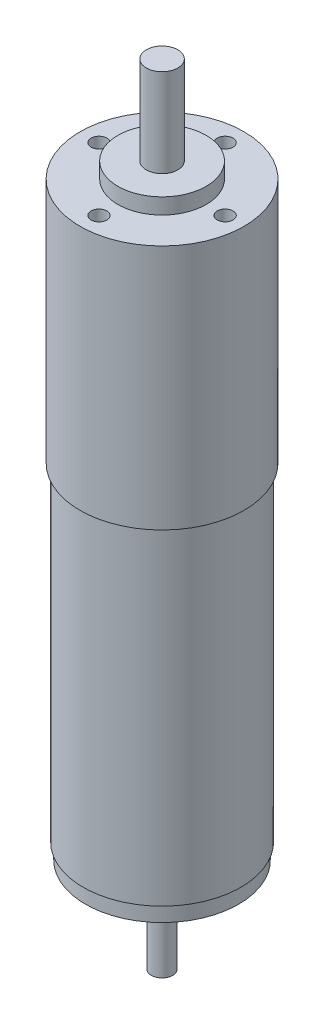
ISO-10303-21;
HEADER;
FILE_DESCRIPTION(('STEP AP214'),'2;1');
FILE_NAME('part.step','',(''),(''),'','','');
FILE_SCHEMA(('AUTOMOTIVE_DESIGN { 1 0 10303 214 1 1 1 1 }'));
ENDSEC;
DATA;
#1=APPLICATION_CONTEXT('core data for automotive mechanical design processes');
#2=APPLICATION_PROTOCOL_DEFINITION('international standard','automotive_design',2000,#1);
#3=PRODUCT_CONTEXT('',#1,'mechanical');
#4=PRODUCT('Part','Part','',(#3));
#5=PRODUCT_RELATED_PRODUCT_CATEGORY('part','',(#4));
#6=PRODUCT_DEFINITION_FORMATION('','',#4);
#7=PRODUCT_DEFINITION_CONTEXT('part definition',#1,'design');
#8=PRODUCT_DEFINITION('design','',#6,#7);
#9=PRODUCT_DEFINITION_SHAPE('','',#8);
#10=(LENGTH_UNIT() NAMED_UNIT(*) SI_UNIT(.MILLI.,.METRE.));
#11=(NAMED_UNIT(*) PLANE_ANGLE_UNIT() SI_UNIT($,.RADIAN.));
#12=(NAMED_UNIT(*) SI_UNIT($,.STERADIAN.) SOLID_ANGLE_UNIT());
#13=UNCERTAINTY_MEASURE_WITH_UNIT(LENGTH_MEASURE(1.E-05),#10,'distance_accuracy_value','');
#14=(GEOMETRIC_REPRESENTATION_CONTEXT(3) GLOBAL_UNCERTAINTY_ASSIGNED_CONTEXT((#13)) GLOBAL_UNIT_ASSIGNED_CONTEXT((#10,
#11,#12)) REPRESENTATION_CONTEXT('',''));
#15=CARTESIAN_POINT('',(0.,0.,0.));
#16=DIRECTION('',(0.,0.,1.));
#17=DIRECTION('',(1.,0.,0.));
#18=AXIS2_PLACEMENT_3D('',#15,#16,#17);
#19=CARTESIAN_POINT('',(0.,0.,0.));
#20=DIRECTION('',(0.,-1.,0.));
#21=DIRECTION('',(0.,0.,-1.));
#22=AXIS2_PLACEMENT_3D('',#19,#20,#21);
#23=PLANE('',#22);
#24=CARTESIAN_POINT('',(0.,0.,0.));
#25=DIRECTION('',(0.,-1.,0.));
#26=DIRECTION('',(0.,0.,-1.));
#27=AXIS2_PLACEMENT_3D('',#24,#25,#26);
#28=CIRCLE('',#27,12.15);
#29=CARTESIAN_POINT('',(0.,0.,-12.15));
#30=VERTEX_POINT('',#29);
#31=EDGE_CURVE('E10',#30,#30,#28,.T.);
#32=ORIENTED_EDGE('',*,*,#31,.T.);
#33=EDGE_LOOP('',(#32));
#34=FACE_BOUND('',#33,.T.);
#35=CARTESIAN_POINT('',(0.,0.,0.));
#36=DIRECTION('',(0.,-1.,0.));
#37=DIRECTION('',(0.,0.,-1.));
#38=AXIS2_PLACEMENT_3D('',#35,#36,#37);
#39=CIRCLE('',#38,4.);
#40=CARTESIAN_POINT('',(0.,0.,-4.));
#41=VERTEX_POINT('',#40);
#42=EDGE_CURVE('E73',#41,#41,#39,.T.);
#43=ORIENTED_EDGE('',*,*,#42,.F.);
#44=EDGE_LOOP('',(#43));
#45=FACE_BOUND('',#44,.T.);
#46=ADVANCED_FACE('F33',(#34,#45),#23,.T.);
#47=CARTESIAN_POINT('',(0.,0.,0.));
#48=DIRECTION('',(0.,-1.,0.));
#49=DIRECTION('',(0.,0.,-1.));
#50=AXIS2_PLACEMENT_3D('',#47,#48,#49);
#51=CYLINDRICAL_SURFACE('',#50,12.15);
#52=CARTESIAN_POINT('',(0.,2.5,0.));
#53=DIRECTION('',(0.,-1.,0.));
#54=DIRECTION('',(0.,0.,-1.));
#55=AXIS2_PLACEMENT_3D('',#52,#53,#54);
#56=CIRCLE('',#55,12.15);
#57=CARTESIAN_POINT('',(0.,2.5,-12.15));
#58=VERTEX_POINT('',#57);
#59=EDGE_CURVE('E40',#58,#58,#56,.T.);
#60=ORIENTED_EDGE('',*,*,#59,.T.);
#61=EDGE_LOOP('',(#60));
#62=FACE_BOUND('',#61,.T.);
#63=ORIENTED_EDGE('',*,*,#31,.F.);
#64=EDGE_LOOP('',(#63));
#65=FACE_BOUND('',#64,.T.);
#66=ADVANCED_FACE('F149',(#62,#65),#51,.T.);
#67=CARTESIAN_POINT('',(12.15,2.5,0.));
#68=DIRECTION('',(0.,-1.,0.));
#69=DIRECTION('',(0.,0.,-1.));
#70=AXIS2_PLACEMENT_3D('',#67,#68,#69);
#71=PLANE('',#70);
#72=CARTESIAN_POINT('',(0.,2.5,0.));
#73=DIRECTION('',(0.,-1.,0.));
#74=DIRECTION('',(0.,0.,-1.));
#75=AXIS2_PLACEMENT_3D('',#72,#73,#74);
#76=CIRCLE('',#75,12.5);
#77=CARTESIAN_POINT('',(0.,2.5,-12.5));
#78=VERTEX_POINT('',#77);
#79=EDGE_CURVE('E44',#78,#78,#76,.T.);
#80=ORIENTED_EDGE('',*,*,#79,.T.);
#81=EDGE_LOOP('',(#80));
#82=FACE_BOUND('',#81,.T.);
#83=ORIENTED_EDGE('',*,*,#59,.F.);
#84=EDGE_LOOP('',(#83));
#85=FACE_BOUND('',#84,.T.);
#86=ADVANCED_FACE('F143',(#82,#85),#71,.T.);
#87=CARTESIAN_POINT('',(0.,0.,0.));
#88=DIRECTION('',(0.,-1.,0.));
#89=DIRECTION('',(0.,0.,-1.));
#90=AXIS2_PLACEMENT_3D('',#87,#88,#89);
#91=CYLINDRICAL_SURFACE('',#90,12.5);
#92=CARTESIAN_POINT('',(0.,54.5,0.));
#93=DIRECTION('',(0.,-1.,0.));
#94=DIRECTION('',(0.,0.,-1.));
#95=AXIS2_PLACEMENT_3D('',#92,#93,#94);
#96=CIRCLE('',#95,12.5);
#97=CARTESIAN_POINT('',(0.,54.5,-12.5));
#98=VERTEX_POINT('',#97);
#99=EDGE_CURVE('E49',#98,#98,#96,.T.);
#100=ORIENTED_EDGE('',*,*,#99,.T.);
#101=EDGE_LOOP('',(#100));
#102=FACE_BOUND('',#101,.T.);
#103=ORIENTED_EDGE('',*,*,#79,.F.);
#104=EDGE_LOOP('',(#103));
#105=FACE_BOUND('',#104,.T.);
#106=ADVANCED_FACE('F137',(#102,#105),#91,.T.);
#107=CARTESIAN_POINT('',(12.5,54.5,0.));
#108=DIRECTION('',(0.,-1.,0.));
#109=DIRECTION('',(0.,0.,-1.));
#110=AXIS2_PLACEMENT_3D('',#107,#108,#109);
#111=PLANE('',#110);
#112=CARTESIAN_POINT('',(0.,54.5,0.));
#113=DIRECTION('',(0.,-1.,0.));
#114=DIRECTION('',(0.,0.,-1.));
#115=AXIS2_PLACEMENT_3D('',#112,#113,#114);
#116=CIRCLE('',#115,13.);
#117=CARTESIAN_POINT('',(0.,54.5,-13.));
#118=VERTEX_POINT('',#117);
#119=EDGE_CURVE('E52',#118,#118,#116,.T.);
#120=ORIENTED_EDGE('',*,*,#119,.T.);
#121=EDGE_LOOP('',(#120));
#122=FACE_BOUND('',#121,.T.);
#123=ORIENTED_EDGE('',*,*,#99,.F.);
#124=EDGE_LOOP('',(#123));
#125=FACE_BOUND('',#124,.T.);
#126=ADVANCED_FACE('F131',(#122,#125),#111,.T.);
#127=CARTESIAN_POINT('',(0.,0.,0.));
#128=DIRECTION('',(0.,-1.,0.));
#129=DIRECTION('',(0.,0.,-1.));
#130=AXIS2_PLACEMENT_3D('',#127,#128,#129);
#131=CYLINDRICAL_SURFACE('',#130,13.);
#132=CARTESIAN_POINT('',(0.,93.5,0.));
#133=DIRECTION('',(0.,-1.,0.));
#134=DIRECTION('',(0.,0.,-1.));
#135=AXIS2_PLACEMENT_3D('',#132,#133,#134);
#136=CIRCLE('',#135,13.);
#137=CARTESIAN_POINT('',(0.,93.5,-13.));
#138=VERTEX_POINT('',#137);
#139=EDGE_CURVE('E55',#138,#138,#136,.T.);
#140=ORIENTED_EDGE('',*,*,#139,.T.);
#141=EDGE_LOOP('',(#140));
#142=FACE_BOUND('',#141,.T.);
#143=ORIENTED_EDGE('',*,*,#119,.F.);
#144=EDGE_LOOP('',(#143));
#145=FACE_BOUND('',#144,.T.);
#146=ADVANCED_FACE('F117',(#142,#145),#131,.T.);
#147=CARTESIAN_POINT('',(13.,93.5,0.));
#148=DIRECTION('',(0.,1.,0.));
#149=DIRECTION('',(0.,0.,1.));
#150=AXIS2_PLACEMENT_3D('',#147,#148,#149);
#151=PLANE('',#150);
#152=CARTESIAN_POINT('',(10.,93.5,0.));
#153=DIRECTION('',(0.,1.,0.));
#154=DIRECTION('',(0.,0.,1.));
#155=AXIS2_PLACEMENT_3D('',#152,#153,#154);
#156=CIRCLE('',#155,1.25);
#157=CARTESIAN_POINT('',(10.,93.5,1.25));
#158=VERTEX_POINT('',#157);
#159=EDGE_CURVE('E98',#158,#158,#156,.T.);
#160=ORIENTED_EDGE('',*,*,#159,.F.);
#161=EDGE_LOOP('',(#160));
#162=FACE_BOUND('',#161,.T.);
#163=CARTESIAN_POINT('',(0.,93.5,10.));
#164=DIRECTION('',(0.,1.,0.));
#165=DIRECTION('',(0.,0.,1.));
#166=AXIS2_PLACEMENT_3D('',#163,#164,#165);
#167=CIRCLE('',#166,1.25);
#168=CARTESIAN_POINT('',(0.,93.5,11.25));
#169=VERTEX_POINT('',#168);
#170=EDGE_CURVE('E92',#169,#169,#167,.T.);
#171=ORIENTED_EDGE('',*,*,#170,.F.);
#172=EDGE_LOOP('',(#171));
#173=FACE_BOUND('',#172,.T.);
#174=CARTESIAN_POINT('',(-10.,93.5,0.));
#175=DIRECTION('',(0.,1.,0.));
#176=DIRECTION('',(0.,0.,1.));
#177=AXIS2_PLACEMENT_3D('',#174,#175,#176);
#178=CIRCLE('',#177,1.25);
#179=CARTESIAN_POINT('',(-10.,93.5,1.25));
#180=VERTEX_POINT('',#179);
#181=EDGE_CURVE('E86',#180,#180,#178,.T.);
#182=ORIENTED_EDGE('',*,*,#181,.F.);
#183=EDGE_LOOP('',(#182));
#184=FACE_BOUND('',#183,.T.);
#185=CARTESIAN_POINT('',(0.,93.5,-10.));
#186=DIRECTION('',(0.,1.,0.));
#187=DIRECTION('',(0.,0.,1.));
#188=AXIS2_PLACEMENT_3D('',#185,#186,#187);
#189=CIRCLE('',#188,1.25);
#190=CARTESIAN_POINT('',(0.,93.5,-8.75));
#191=VERTEX_POINT('',#190);
#192=EDGE_CURVE('E80',#191,#191,#189,.T.);
#193=ORIENTED_EDGE('',*,*,#192,.F.);
#194=EDGE_LOOP('',(#193));
#195=FACE_BOUND('',#194,.T.);
#196=CARTESIAN_POINT('',(0.,93.5,0.));
#197=DIRECTION('',(0.,-1.,0.));
#198=DIRECTION('',(0.,0.,-1.));
#199=AXIS2_PLACEMENT_3D('',#196,#197,#198);
#200=CIRCLE('',#199,7.);
#201=CARTESIAN_POINT('',(0.,93.5,-7.));
#202=VERTEX_POINT('',#201);
#203=EDGE_CURVE('E58',#202,#202,#200,.T.);
#204=ORIENTED_EDGE('',*,*,#203,.T.);
#205=EDGE_LOOP('',(#204));
#206=FACE_BOUND('',#205,.T.);
#207=ORIENTED_EDGE('',*,*,#139,.F.);
#208=EDGE_LOOP('',(#207));
#209=FACE_BOUND('',#208,.T.);
#210=ADVANCED_FACE('F113',(#162,#173,#184,#195,#206,#209),#151,.T.);
#211=CARTESIAN_POINT('',(0.,0.,0.));
#212=DIRECTION('',(0.,-1.,0.));
#213=DIRECTION('',(0.,0.,-1.));
#214=AXIS2_PLACEMENT_3D('',#211,#212,#213);
#215=CYLINDRICAL_SURFACE('',#214,7.);
#216=CARTESIAN_POINT('',(0.,96.,0.));
#217=DIRECTION('',(0.,-1.,0.));
#218=DIRECTION('',(0.,0.,-1.));
#219=AXIS2_PLACEMENT_3D('',#216,#217,#218);
#220=CIRCLE('',#219,7.);
#221=CARTESIAN_POINT('',(0.,96.,-7.));
#222=VERTEX_POINT('',#221);
#223=EDGE_CURVE('E61',#222,#222,#220,.T.);
#224=ORIENTED_EDGE('',*,*,#223,.T.);
#225=EDGE_LOOP('',(#224));
#226=FACE_BOUND('',#225,.T.);
#227=ORIENTED_EDGE('',*,*,#203,.F.);
#228=EDGE_LOOP('',(#227));
#229=FACE_BOUND('',#228,.T.);
#230=ADVANCED_FACE('F116',(#226,#229),#215,.T.);
#231=CARTESIAN_POINT('',(7.,96.,0.));
#232=DIRECTION('',(0.,1.,0.));
#233=DIRECTION('',(0.,0.,1.));
#234=AXIS2_PLACEMENT_3D('',#231,#232,#233);
#235=PLANE('',#234);
#236=CARTESIAN_POINT('',(0.,96.,0.));
#237=DIRECTION('',(0.,-1.,0.));
#238=DIRECTION('',(0.,0.,-1.));
#239=AXIS2_PLACEMENT_3D('',#236,#237,#238);
#240=CIRCLE('',#239,2.5);
#241=CARTESIAN_POINT('',(0.,96.,-2.5));
#242=VERTEX_POINT('',#241);
#243=EDGE_CURVE('E64',#242,#242,#240,.T.);
#244=ORIENTED_EDGE('',*,*,#243,.T.);
#245=EDGE_LOOP('',(#244));
#246=FACE_BOUND('',#245,.T.);
#247=ORIENTED_EDGE('',*,*,#223,.F.);
#248=EDGE_LOOP('',(#247));
#249=FACE_BOUND('',#248,.T.);
#250=ADVANCED_FACE('F161',(#246,#249),#235,.T.);
#251=CARTESIAN_POINT('',(0.,0.,0.));
#252=DIRECTION('',(0.,-1.,0.));
#253=DIRECTION('',(0.,0.,-1.));
#254=AXIS2_PLACEMENT_3D('',#251,#252,#253);
#255=CYLINDRICAL_SURFACE('',#254,2.5);
#256=CARTESIAN_POINT('',(0.,110.,0.));
#257=DIRECTION('',(0.,-1.,0.));
#258=DIRECTION('',(0.,0.,-1.));
#259=AXIS2_PLACEMENT_3D('',#256,#257,#258);
#260=CIRCLE('',#259,2.5);
#261=CARTESIAN_POINT('',(0.,110.,-2.5));
#262=VERTEX_POINT('',#261);
#263=EDGE_CURVE('E67',#262,#262,#260,.T.);
#264=ORIENTED_EDGE('',*,*,#263,.T.);
#265=EDGE_LOOP('',(#264));
#266=FACE_BOUND('',#265,.T.);
#267=ORIENTED_EDGE('',*,*,#243,.F.);
#268=EDGE_LOOP('',(#267));
#269=FACE_BOUND('',#268,.T.);
#270=ADVANCED_FACE('F165',(#266,#269),#255,.T.);
#271=CARTESIAN_POINT('',(2.5,110.,0.));
#272=DIRECTION('',(0.,1.,0.));
#273=DIRECTION('',(0.,0.,1.));
#274=AXIS2_PLACEMENT_3D('',#271,#272,#273);
#275=PLANE('',#274);
#276=ORIENTED_EDGE('',*,*,#263,.F.);
#277=EDGE_LOOP('',(#276));
#278=FACE_BOUND('',#277,.T.);
#279=ADVANCED_FACE('F169',(#278),#275,.T.);
#280=CARTESIAN_POINT('',(0.,-2.5,0.));
#281=DIRECTION('',(0.,-1.,0.));
#282=DIRECTION('',(0.,0.,-1.));
#283=AXIS2_PLACEMENT_3D('',#280,#281,#282);
#284=PLANE('',#283);
#285=CARTESIAN_POINT('',(0.,-2.5,0.));
#286=DIRECTION('',(0.,-1.,0.));
#287=DIRECTION('',(0.,0.,-1.));
#288=AXIS2_PLACEMENT_3D('',#285,#286,#287);
#289=CIRCLE('',#288,4.);
#290=CARTESIAN_POINT('',(0.,-2.5,-4.));
#291=VERTEX_POINT('',#290);
#292=EDGE_CURVE('E76',#291,#291,#289,.T.);
#293=ORIENTED_EDGE('',*,*,#292,.T.);
#294=EDGE_LOOP('',(#293));
#295=FACE_BOUND('',#294,.T.);
#296=CARTESIAN_POINT('',(0.,-2.5,0.));
#297=DIRECTION('',(0.,-1.,0.));
#298=DIRECTION('',(0.,0.,-1.));
#299=AXIS2_PLACEMENT_3D('',#296,#297,#298);
#300=CIRCLE('',#299,1.69275807705358);
#301=CARTESIAN_POINT('',(0.,-2.5,-1.69275807705358));
#302=VERTEX_POINT('',#301);
#303=EDGE_CURVE('E36',#302,#302,#300,.T.);
#304=ORIENTED_EDGE('',*,*,#303,.F.);
#305=EDGE_LOOP('',(#304));
#306=FACE_BOUND('',#305,.T.);
#307=ADVANCED_FACE('F173',(#295,#306),#284,.T.);
#308=CARTESIAN_POINT('',(0.,-2.5,0.));
#309=DIRECTION('',(0.,1.,0.));
#310=DIRECTION('',(0.,0.,1.));
#311=AXIS2_PLACEMENT_3D('',#308,#309,#310);
#312=CYLINDRICAL_SURFACE('',#311,4.);
#313=ORIENTED_EDGE('',*,*,#292,.F.);
#314=EDGE_LOOP('',(#313));
#315=FACE_BOUND('',#314,.T.);
#316=ORIENTED_EDGE('',*,*,#42,.T.);
#317=EDGE_LOOP('',(#316));
#318=FACE_BOUND('',#317,.T.);
#319=ADVANCED_FACE('F183',(#315,#318),#312,.T.);
#320=CARTESIAN_POINT('',(0.,-15.,0.));
#321=DIRECTION('',(0.,-1.,0.));
#322=DIRECTION('',(0.,0.,-1.));
#323=AXIS2_PLACEMENT_3D('',#320,#321,#322);
#324=PLANE('',#323);
#325=CARTESIAN_POINT('',(0.,-15.,0.));
#326=DIRECTION('',(0.,-1.,0.));
#327=DIRECTION('',(0.,0.,-1.));
#328=AXIS2_PLACEMENT_3D('',#325,#326,#327);
#329=CIRCLE('',#328,1.69275807705358);
#330=CARTESIAN_POINT('',(0.,-15.,-1.69275807705358));
#331=VERTEX_POINT('',#330);
#332=EDGE_CURVE('E70',#331,#331,#329,.T.);
#333=ORIENTED_EDGE('',*,*,#332,.T.);
#334=EDGE_LOOP('',(#333));
#335=FACE_BOUND('',#334,.T.);
#336=ADVANCED_FACE('F179',(#335),#324,.T.);
#337=CARTESIAN_POINT('',(0.,-15.,0.));
#338=DIRECTION('',(0.,1.,0.));
#339=DIRECTION('',(0.,0.,1.));
#340=AXIS2_PLACEMENT_3D('',#337,#338,#339);
#341=CYLINDRICAL_SURFACE('',#340,1.69275807705358);
#342=ORIENTED_EDGE('',*,*,#303,.T.);
#343=EDGE_LOOP('',(#342));
#344=FACE_BOUND('',#343,.T.);
#345=ORIENTED_EDGE('',*,*,#332,.F.);
#346=EDGE_LOOP('',(#345));
#347=FACE_BOUND('',#346,.T.);
#348=ADVANCED_FACE('F175',(#344,#347),#341,.T.);
#349=CARTESIAN_POINT('',(0.,88.5,-10.));
#350=DIRECTION('',(0.,1.,0.));
#351=DIRECTION('',(0.,0.,1.));
#352=AXIS2_PLACEMENT_3D('',#349,#350,#351);
#353=CYLINDRICAL_SURFACE('',#352,1.25);
#354=CARTESIAN_POINT('',(0.,88.5,-10.));
#355=DIRECTION('',(0.,1.,0.));
#356=DIRECTION('',(0.,0.,1.));
#357=AXIS2_PLACEMENT_3D('',#354,#355,#356);
#358=CIRCLE('',#357,1.25);
#359=CARTESIAN_POINT('',(0.,88.5,-8.75));
#360=VERTEX_POINT('',#359);
#361=EDGE_CURVE('E77',#360,#360,#358,.T.);
#362=ORIENTED_EDGE('',*,*,#361,.F.);
#363=EDGE_LOOP('',(#362));
#364=FACE_BOUND('',#363,.T.);
#365=ORIENTED_EDGE('',*,*,#192,.T.);
#366=EDGE_LOOP('',(#365));
#367=FACE_BOUND('',#366,.T.);
#368=ADVANCED_FACE('F178',(#364,#367),#353,.F.);
#369=CARTESIAN_POINT('',(0.,88.5,-10.));
#370=DIRECTION('',(0.,1.,0.));
#371=DIRECTION('',(0.,0.,1.));
#372=AXIS2_PLACEMENT_3D('',#369,#370,#371);
#373=PLANE('',#372);
#374=ORIENTED_EDGE('',*,*,#361,.T.);
#375=EDGE_LOOP('',(#374));
#376=FACE_BOUND('',#375,.T.);
#377=ADVANCED_FACE('F193',(#376),#373,.T.);
#378=CARTESIAN_POINT('',(-10.,88.5,0.));
#379=DIRECTION('',(0.,1.,0.));
#380=DIRECTION('',(0.,0.,1.));
#381=AXIS2_PLACEMENT_3D('',#378,#379,#380);
#382=CYLINDRICAL_SURFACE('',#381,1.25);
#383=CARTESIAN_POINT('',(-10.,88.5,0.));
#384=DIRECTION('',(0.,1.,0.));
#385=DIRECTION('',(0.,0.,1.));
#386=AXIS2_PLACEMENT_3D('',#383,#384,#385);
#387=CIRCLE('',#386,1.25);
#388=CARTESIAN_POINT('',(-10.,88.5,1.25));
#389=VERTEX_POINT('',#388);
#390=EDGE_CURVE('E89',#389,#389,#387,.T.);
#391=ORIENTED_EDGE('',*,*,#390,.F.);
#392=EDGE_LOOP('',(#391));
#393=FACE_BOUND('',#392,.T.);
#394=ORIENTED_EDGE('',*,*,#181,.T.);
#395=EDGE_LOOP('',(#394));
#396=FACE_BOUND('',#395,.T.);
#397=ADVANCED_FACE('F197',(#393,#396),#382,.F.);
#398=CARTESIAN_POINT('',(-10.,88.5,0.));
#399=DIRECTION('',(0.,1.,0.));
#400=DIRECTION('',(0.,0.,1.));
#401=AXIS2_PLACEMENT_3D('',#398,#399,#400);
#402=PLANE('',#401);
#403=ORIENTED_EDGE('',*,*,#390,.T.);
#404=EDGE_LOOP('',(#403));
#405=FACE_BOUND('',#404,.T.);
#406=ADVANCED_FACE('F201',(#405),#402,.T.);
#407=CARTESIAN_POINT('',(0.,88.5,10.));
#408=DIRECTION('',(0.,1.,0.));
#409=DIRECTION('',(0.,0.,1.));
#410=AXIS2_PLACEMENT_3D('',#407,#408,#409);
#411=CYLINDRICAL_SURFACE('',#410,1.25);
#412=CARTESIAN_POINT('',(0.,88.5,10.));
#413=DIRECTION('',(0.,1.,0.));
#414=DIRECTION('',(0.,0.,1.));
#415=AXIS2_PLACEMENT_3D('',#412,#413,#414);
#416=CIRCLE('',#415,1.25);
#417=CARTESIAN_POINT('',(0.,88.5,11.25));
#418=VERTEX_POINT('',#417);
#419=EDGE_CURVE('E95',#418,#418,#416,.T.);
#420=ORIENTED_EDGE('',*,*,#419,.F.);
#421=EDGE_LOOP('',(#420));
#422=FACE_BOUND('',#421,.T.);
#423=ORIENTED_EDGE('',*,*,#170,.T.);
#424=EDGE_LOOP('',(#423));
#425=FACE_BOUND('',#424,.T.);
#426=ADVANCED_FACE('F205',(#422,#425),#411,.F.);
#427=CARTESIAN_POINT('',(0.,88.5,10.));
#428=DIRECTION('',(0.,1.,0.));
#429=DIRECTION('',(0.,0.,1.));
#430=AXIS2_PLACEMENT_3D('',#427,#428,#429);
#431=PLANE('',#430);
#432=ORIENTED_EDGE('',*,*,#419,.T.);
#433=EDGE_LOOP('',(#432));
#434=FACE_BOUND('',#433,.T.);
#435=ADVANCED_FACE('F109',(#434),#431,.T.);
#436=CARTESIAN_POINT('',(10.,88.5,0.));
#437=DIRECTION('',(0.,1.,0.));
#438=DIRECTION('',(0.,0.,1.));
#439=AXIS2_PLACEMENT_3D('',#436,#437,#438);
#440=CYLINDRICAL_SURFACE('',#439,1.25);
#441=CARTESIAN_POINT('',(10.,88.5,0.));
#442=DIRECTION('',(0.,1.,0.));
#443=DIRECTION('',(0.,0.,1.));
#444=AXIS2_PLACEMENT_3D('',#441,#442,#443);
#445=CIRCLE('',#444,1.25);
#446=CARTESIAN_POINT('',(10.,88.5,1.25));
#447=VERTEX_POINT('',#446);
#448=EDGE_CURVE('E83',#447,#447,#445,.T.);
#449=ORIENTED_EDGE('',*,*,#448,.F.);
#450=EDGE_LOOP('',(#449));
#451=FACE_BOUND('',#450,.T.);
#452=ORIENTED_EDGE('',*,*,#159,.T.);
#453=EDGE_LOOP('',(#452));
#454=FACE_BOUND('',#453,.T.);
#455=ADVANCED_FACE('F106',(#451,#454),#440,.F.);
#456=CARTESIAN_POINT('',(10.,88.5,0.));
#457=DIRECTION('',(0.,1.,0.));
#458=DIRECTION('',(0.,0.,1.));
#459=AXIS2_PLACEMENT_3D('',#456,#457,#458);
#460=PLANE('',#459);
#461=ORIENTED_EDGE('',*,*,#448,.T.);
#462=EDGE_LOOP('',(#461));
#463=FACE_BOUND('',#462,.T.);
#464=ADVANCED_FACE('F104',(#463),#460,.T.);
#465=CLOSED_SHELL('',(#46,#66,#86,#106,#126,#146,#210,#230,#250,#270,#279,#307,#319,#336,#348,
#368,#377,#397,#406,#426,#435,#455,#464));
#466=MANIFOLD_SOLID_BREP('B2',#465);
#467=ADVANCED_BREP_SHAPE_REPRESENTATION('',(#18,#466),#14);
#468=SHAPE_DEFINITION_REPRESENTATION(#9,#467);
ENDSEC;
END-ISO-10303-21;
